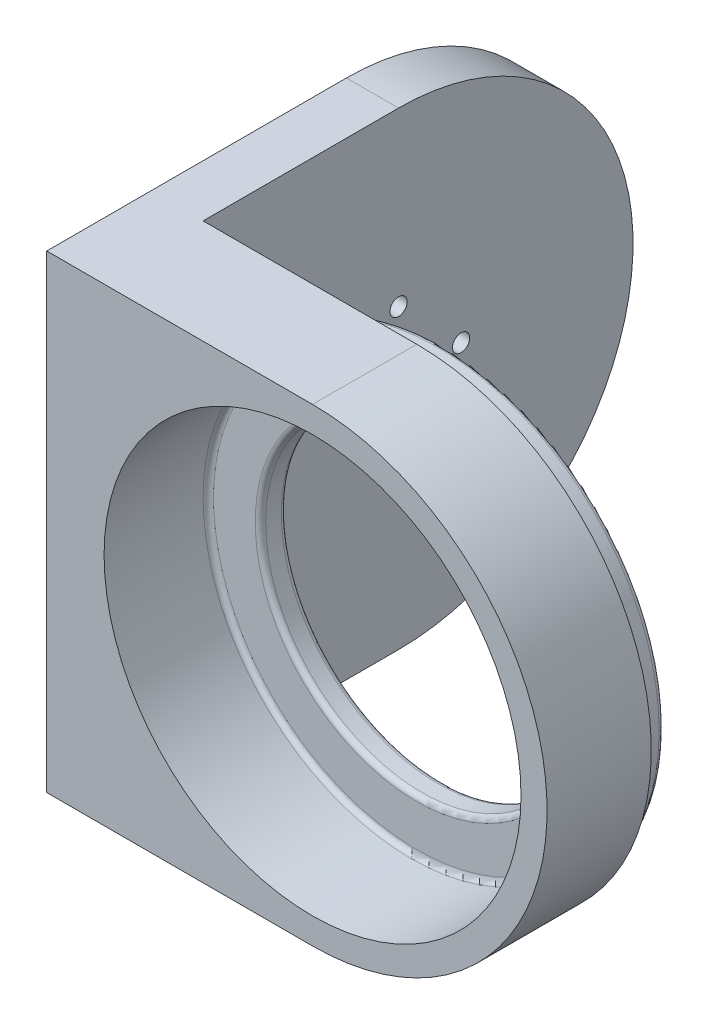
ISO-10303-21;
HEADER;
FILE_DESCRIPTION(('STEP AP214'),'2;1');
FILE_NAME('part.step','',(''),(''),'','','');
FILE_SCHEMA(('AUTOMOTIVE_DESIGN { 1 0 10303 214 1 1 1 1 }'));
ENDSEC;
DATA;
#1=APPLICATION_CONTEXT('core data for automotive mechanical design processes');
#2=APPLICATION_PROTOCOL_DEFINITION('international standard','automotive_design',2000,#1);
#3=PRODUCT_CONTEXT('',#1,'mechanical');
#4=PRODUCT('Part','Part','',(#3));
#5=PRODUCT_RELATED_PRODUCT_CATEGORY('part','',(#4));
#6=PRODUCT_DEFINITION_FORMATION('','',#4);
#7=PRODUCT_DEFINITION_CONTEXT('part definition',#1,'design');
#8=PRODUCT_DEFINITION('design','',#6,#7);
#9=PRODUCT_DEFINITION_SHAPE('','',#8);
#10=(LENGTH_UNIT() NAMED_UNIT(*) SI_UNIT(.MILLI.,.METRE.));
#11=(NAMED_UNIT(*) PLANE_ANGLE_UNIT() SI_UNIT($,.RADIAN.));
#12=(NAMED_UNIT(*) SI_UNIT($,.STERADIAN.) SOLID_ANGLE_UNIT());
#13=UNCERTAINTY_MEASURE_WITH_UNIT(LENGTH_MEASURE(1.E-05),#10,'distance_accuracy_value','');
#14=(GEOMETRIC_REPRESENTATION_CONTEXT(3) GLOBAL_UNCERTAINTY_ASSIGNED_CONTEXT((#13)) GLOBAL_UNIT_ASSIGNED_CONTEXT((#10,
#11,#12)) REPRESENTATION_CONTEXT('',''));
#15=CARTESIAN_POINT('',(0.,0.,0.));
#16=DIRECTION('',(0.,0.,1.));
#17=DIRECTION('',(1.,0.,0.));
#18=AXIS2_PLACEMENT_3D('',#15,#16,#17);
#19=CARTESIAN_POINT('',(0.,0.,15.));
#20=DIRECTION('',(0.,0.,1.));
#21=DIRECTION('',(1.,0.,0.));
#22=AXIS2_PLACEMENT_3D('',#19,#20,#21);
#23=CYLINDRICAL_SURFACE('',#22,42.5);
#24=CARTESIAN_POINT('',(0.,0.,19.));
#25=DIRECTION('',(0.,0.,-1.));
#26=DIRECTION('',(-1.,0.,0.));
#27=AXIS2_PLACEMENT_3D('',#24,#25,#26);
#28=CIRCLE('',#27,42.5);
#29=CARTESIAN_POINT('',(-41.,11.1915146427997,19.));
#30=VERTEX_POINT('',#29);
#31=CARTESIAN_POINT('',(-41.,-11.1915146427997,19.));
#32=VERTEX_POINT('',#31);
#33=EDGE_CURVE('E266',#30,#32,#28,.T.);
#34=ORIENTED_EDGE('',*,*,#33,.T.);
#35=DIRECTION('',(0.,0.,1.));
#36=VECTOR('',#35,1.);
#37=CARTESIAN_POINT('',(-41.,-11.1915146427997,15.));
#38=LINE('',#37,#36);
#39=CARTESIAN_POINT('',(-41.,-11.1915146427997,16.));
#40=VERTEX_POINT('',#39);
#41=EDGE_CURVE('E60',#32,#40,#38,.F.);
#42=ORIENTED_EDGE('',*,*,#41,.T.);
#43=CARTESIAN_POINT('',(0.,0.,16.));
#44=DIRECTION('',(0.,0.,1.));
#45=DIRECTION('',(1.,0.,0.));
#46=AXIS2_PLACEMENT_3D('',#43,#44,#45);
#47=CIRCLE('',#46,42.5);
#48=CARTESIAN_POINT('',(-41.,11.1915146427997,16.));
#49=VERTEX_POINT('',#48);
#50=EDGE_CURVE('E264',#40,#49,#47,.T.);
#51=ORIENTED_EDGE('',*,*,#50,.T.);
#52=DIRECTION('',(0.,0.,1.));
#53=VECTOR('',#52,1.);
#54=CARTESIAN_POINT('',(-41.,11.1915146427997,15.));
#55=LINE('',#54,#53);
#56=EDGE_CURVE('E160',#49,#30,#55,.T.);
#57=ORIENTED_EDGE('',*,*,#56,.T.);
#58=EDGE_LOOP('',(#34,#42,#51,#57));
#59=FACE_BOUND('',#58,.T.);
#60=ADVANCED_FACE('F39',(#59),#23,.T.);
#61=CARTESIAN_POINT('',(0.,0.,15.));
#62=DIRECTION('',(0.,0.,1.));
#63=DIRECTION('',(1.,0.,0.));
#64=AXIS2_PLACEMENT_3D('',#61,#62,#63);
#65=PLANE('',#64);
#66=CARTESIAN_POINT('',(0.,0.,15.));
#67=DIRECTION('',(0.,0.,1.));
#68=DIRECTION('',(1.,0.,0.));
#69=AXIS2_PLACEMENT_3D('',#66,#67,#68);
#70=CIRCLE('',#69,31.);
#71=CARTESIAN_POINT('',(31.,0.,15.));
#72=VERTEX_POINT('',#71);
#73=EDGE_CURVE('E261',#72,#72,#70,.T.);
#74=ORIENTED_EDGE('',*,*,#73,.T.);
#75=EDGE_LOOP('',(#74));
#76=FACE_BOUND('',#75,.T.);
#77=DIRECTION('',(0.,-1.,0.));
#78=VECTOR('',#77,1.);
#79=CARTESIAN_POINT('',(-41.,0.,15.));
#80=LINE('',#79,#78);
#81=CARTESIAN_POINT('',(-41.,6.42261628933261,15.));
#82=VERTEX_POINT('',#81);
#83=CARTESIAN_POINT('',(-41.,-6.42261628933263,15.));
#84=VERTEX_POINT('',#83);
#85=EDGE_CURVE('E155',#82,#84,#80,.T.);
#86=ORIENTED_EDGE('',*,*,#85,.F.);
#87=CARTESIAN_POINT('',(0.,0.,15.));
#88=DIRECTION('',(0.,0.,1.));
#89=DIRECTION('',(1.,0.,0.));
#90=AXIS2_PLACEMENT_3D('',#87,#88,#89);
#91=CIRCLE('',#90,41.5);
#92=EDGE_CURVE('E258',#82,#84,#91,.F.);
#93=ORIENTED_EDGE('',*,*,#92,.T.);
#94=EDGE_LOOP('',(#86,#93));
#95=FACE_BOUND('',#94,.T.);
#96=ADVANCED_FACE('F190',(#76,#95),#65,.F.);
#97=CARTESIAN_POINT('',(0.,0.,16.));
#98=DIRECTION('',(0.,0.,1.));
#99=DIRECTION('',(1.,0.,0.));
#100=AXIS2_PLACEMENT_3D('',#97,#98,#99);
#101=TOROIDAL_SURFACE('',#100,41.5,1.);
#102=ORIENTED_EDGE('',*,*,#92,.F.);
#103=CARTESIAN_POINT('',(-41.,0.,15.1339745962156));
#104=CARTESIAN_POINT('',(-41.,0.16654925954188,15.1339759944302));
#105=CARTESIAN_POINT('',(-41.,0.333098186055232,15.1333866185253));
#106=CARTESIAN_POINT('',(-41.,0.666214097558139,15.1310613578074));
#107=CARTESIAN_POINT('',(-41.,0.832781081304264,15.129325293903));
#108=CARTESIAN_POINT('',(-41.,1.16616873406545,15.1247856559886));
#109=CARTESIAN_POINT('',(-41.,1.33298937924066,15.1219803658554));
#110=CARTESIAN_POINT('',(-41.,1.66654317779587,15.1154426836272));
#111=CARTESIAN_POINT('',(-41.,1.83327633881012,15.1117106757406));
#112=CARTESIAN_POINT('',(-41.,2.33417011704879,15.0993658194511));
#113=CARTESIAN_POINT('',(-41.,2.66830206988371,15.089615407363));
#114=CARTESIAN_POINT('',(-41.,3.33652923321748,15.0689362654192));
#115=CARTESIAN_POINT('',(-41.,3.67062444332336,15.0580075239952));
#116=CARTESIAN_POINT('',(-41.,4.33996879827621,15.0371760440893));
#117=CARTESIAN_POINT('',(-41.,4.675218065342,15.027276859354));
#118=CARTESIAN_POINT('',(-41.,5.3457053195771,15.0111084654765));
#119=CARTESIAN_POINT('',(-41.,5.68094327707137,15.0048381145433));
#120=CARTESIAN_POINT('',(-41.,6.35144343052128,14.9988806619948));
#121=CARTESIAN_POINT('',(-41.,6.68670560873505,14.9991922655483));
#122=CARTESIAN_POINT('',(-41.,7.18969200102459,15.0074746540093));
#123=CARTESIAN_POINT('',(-41.,7.35747779178201,15.0115430929769));
#124=CARTESIAN_POINT('',(-41.,7.69293113471216,15.0229323615611));
#125=CARTESIAN_POINT('',(-41.,7.86059869470406,15.0302529508853));
#126=CARTESIAN_POINT('',(-41.,8.19447134938655,15.0488624751499));
#127=CARTESIAN_POINT('',(-41.,8.36067805035496,15.0601215062284));
#128=CARTESIAN_POINT('',(-41.,8.69273428796093,15.0876619001442));
#129=CARTESIAN_POINT('',(-41.,8.85858369932516,15.1039448033291));
#130=CARTESIAN_POINT('',(-41.,9.18918926649076,15.1429561228353));
#131=CARTESIAN_POINT('',(-41.,9.35394703167194,15.1656701548952));
#132=CARTESIAN_POINT('',(-41.,9.59994275508619,15.2063617442809));
#133=CARTESIAN_POINT('',(-41.,9.68172965653085,15.2210242698815));
#134=CARTESIAN_POINT('',(-41.,9.84477554461047,15.2530198764621));
#135=CARTESIAN_POINT('',(-41.,9.92603461859115,15.2703525032174));
#136=CARTESIAN_POINT('',(-41.,10.0482150011826,15.2990343442899));
#137=CARTESIAN_POINT('',(-41.,10.0894236147881,15.3091628593734));
#138=CARTESIAN_POINT('',(-41.,10.1715925660758,15.3304029576426));
#139=CARTESIAN_POINT('',(-41.,10.2125528723192,15.3415146626449));
#140=CARTESIAN_POINT('',(-41.,10.3352017696839,15.3765934605147));
#141=CARTESIAN_POINT('',(-41.,10.4164161625184,15.4022490986213));
#142=CARTESIAN_POINT('',(-41.,10.5759350774047,15.4593907983805));
#143=CARTESIAN_POINT('',(-41.,10.654260934456,15.4908141908282));
#144=CARTESIAN_POINT('',(-41.,10.7684273124471,15.5446456538991));
#145=CARTESIAN_POINT('',(-41.,10.8058561267912,15.5636600245523));
#146=CARTESIAN_POINT('',(-41.,10.87907402303,15.6045896023595));
#147=CARTESIAN_POINT('',(-41.,10.9148650928253,15.6265011600168));
#148=CARTESIAN_POINT('',(-41.,10.9843711679713,15.674534555652));
#149=CARTESIAN_POINT('',(-41.,11.0180449045295,15.7007169314957));
#150=CARTESIAN_POINT('',(-41.,11.0803198784303,15.7584375675631));
#151=CARTESIAN_POINT('',(-41.,11.1089670574338,15.7899215358693));
#152=CARTESIAN_POINT('',(-41.,11.142206123792,15.8389072785835));
#153=CARTESIAN_POINT('',(-41.,11.1509560383008,15.8535518574141));
#154=CARTESIAN_POINT('',(-41.,11.166287957566,15.8839622628997));
#155=CARTESIAN_POINT('',(-41.,11.1728698680017,15.8997281383012));
#156=CARTESIAN_POINT('',(-41.,11.1833261275299,15.9323481227474));
#157=CARTESIAN_POINT('',(-41.,11.1871703958418,15.9492121645072));
#158=CARTESIAN_POINT('',(-41.,11.1915408589256,15.9833595985642));
#159=CARTESIAN_POINT('',(-41.,11.1920713165518,16.0006424233835));
#160=CARTESIAN_POINT('',(-41.,11.1898777990685,16.0331332698421));
#161=CARTESIAN_POINT('',(-41.,11.1874949920205,16.0483659308271));
#162=CARTESIAN_POINT('',(-41.,11.180295603012,16.0782438085733));
#163=CARTESIAN_POINT('',(-41.,11.1754767199281,16.0928884557509));
#164=CARTESIAN_POINT('',(-41.,11.1614140246486,16.1272018995007));
#165=CARTESIAN_POINT('',(-41.,11.1511651151961,16.1464547588343));
#166=CARTESIAN_POINT('',(-41.,11.1278032545629,16.18312756366));
#167=CARTESIAN_POINT('',(-41.,11.1146830032116,16.2005426664));
#168=CARTESIAN_POINT('',(-41.,11.0752643426766,16.2468788437573));
#169=CARTESIAN_POINT('',(-41.,11.0467896471521,16.2739234981883));
#170=CARTESIAN_POINT('',(-41.,10.9864700731128,16.3238865388086));
#171=CARTESIAN_POINT('',(-41.,10.9546151541657,16.3467920530386));
#172=CARTESIAN_POINT('',(-41.,10.8714923195934,16.4008449825592));
#173=CARTESIAN_POINT('',(-41.,10.8188909077901,16.4299182422838));
#174=CARTESIAN_POINT('',(-41.,10.7112321130776,16.4831783551134));
#175=CARTESIAN_POINT('',(-41.,10.6561692872689,16.5073536513009));
#176=CARTESIAN_POINT('',(-41.,10.5443079870043,16.5521869791427));
#177=CARTESIAN_POINT('',(-41.,10.4875019118678,16.5728258586398));
#178=CARTESIAN_POINT('',(-41.,10.3730207727194,16.6112396357736));
#179=CARTESIAN_POINT('',(-41.,10.3153467971812,16.6290178391343));
#180=CARTESIAN_POINT('',(-41.,10.1421323054648,16.6787538727931));
#181=CARTESIAN_POINT('',(-41.,10.0256424462261,16.7073952186103));
#182=CARTESIAN_POINT('',(-41.,9.79128973266856,16.7584724852802));
#183=CARTESIAN_POINT('',(-41.,9.67342601655404,16.7809042654825));
#184=CARTESIAN_POINT('',(-41.,9.43663841734632,16.8210761910702));
#185=CARTESIAN_POINT('',(-41.,9.31771274538484,16.8388056651092));
#186=CARTESIAN_POINT('',(-41.,9.07935882723929,16.8705014409789));
#187=CARTESIAN_POINT('',(-41.,8.9599305287597,16.8844673408815));
#188=CARTESIAN_POINT('',(-41.,8.72064199550034,16.9093359781969));
#189=CARTESIAN_POINT('',(-41.,8.60078145284299,16.920235711536));
#190=CARTESIAN_POINT('',(-41.,8.36085059828731,16.9394648634152));
#191=CARTESIAN_POINT('',(-41.,8.24078027350425,16.9477941180661));
#192=CARTESIAN_POINT('',(-41.,7.88073727510217,16.9695166978232));
#193=CARTESIAN_POINT('',(-41.,7.64057007398002,16.9796798242291));
#194=CARTESIAN_POINT('',(-41.,7.0939308665163,16.9956684851266));
#195=CARTESIAN_POINT('',(-41.,6.7874084389766,16.99952946596));
#196=CARTESIAN_POINT('',(-41.,6.17433866169714,17.0003885224842));
#197=CARTESIAN_POINT('',(-41.,5.86779131359375,16.9973857452877));
#198=CARTESIAN_POINT('',(-41.,5.25449900250148,16.9870362856839));
#199=CARTESIAN_POINT('',(-41.,4.94775411600042,16.9796856232929));
#200=CARTESIAN_POINT('',(-41.,4.33432424487866,16.9627650824445));
#201=CARTESIAN_POINT('',(-41.,4.02763926159554,16.9531951590883));
#202=CARTESIAN_POINT('',(-41.,3.41508805409059,16.9337422061518));
#203=CARTESIAN_POINT('',(-41.,3.10922180005842,16.9238600672482));
#204=CARTESIAN_POINT('',(-41.,2.49744523013731,16.9054156026152));
#205=CARTESIAN_POINT('',(-41.,2.19153491397005,16.8968532856244));
#206=CARTESIAN_POINT('',(-41.,1.57982298562344,16.8824296501828));
#207=CARTESIAN_POINT('',(-41.,1.27402141201625,16.8765667822047));
#208=CARTESIAN_POINT('',(-41.,0.66237087902789,16.8684828024491));
#209=CARTESIAN_POINT('',(-41.,0.356521920222649,16.8662616494249));
#210=CARTESIAN_POINT('',(-41.,-0.255220040270112,16.8658252835105));
#211=CARTESIAN_POINT('',(-41.,-0.561113042362815,16.8676106079563));
#212=CARTESIAN_POINT('',(-41.,-1.17285556768692,16.8748951471053));
#213=CARTESIAN_POINT('',(-41.,-1.47870509042251,16.8803944012179));
#214=CARTESIAN_POINT('',(-41.,-2.09048440647676,16.8942192020807));
#215=CARTESIAN_POINT('',(-41.,-2.39641416727031,16.9025461119192));
#216=CARTESIAN_POINT('',(-41.,-3.00822554152113,16.9206873951668));
#217=CARTESIAN_POINT('',(-41.,-3.3141071552214,16.9305017608108));
#218=CARTESIAN_POINT('',(-41.,-3.92602831047681,16.9499912317255));
#219=CARTESIAN_POINT('',(-41.,-4.23206785437363,16.9596662647599));
#220=CARTESIAN_POINT('',(-41.,-4.84420233981981,16.9770266048787));
#221=CARTESIAN_POINT('',(-41.,-5.15029728021104,16.984711949619));
#222=CARTESIAN_POINT('',(-41.,-5.76241321298978,16.9960065954786));
#223=CARTESIAN_POINT('',(-41.,-6.06843416296469,16.9996179820786));
#224=CARTESIAN_POINT('',(-41.,-6.68047543659044,17.0003268669272));
#225=CARTESIAN_POINT('',(-41.,-6.98649575627693,16.9974251132222));
#226=CARTESIAN_POINT('',(-41.,-7.47780871530593,16.9849435855977));
#227=CARTESIAN_POINT('',(-41.,-7.66317605954306,16.9784444127436));
#228=CARTESIAN_POINT('',(-41.,-8.03375037238825,16.9608837997502));
#229=CARTESIAN_POINT('',(-41.,-8.21895728597525,16.9498211598203));
#230=CARTESIAN_POINT('',(-41.,-8.58904285537393,16.9218433176448));
#231=CARTESIAN_POINT('',(-41.,-8.77392131339548,16.904925336997));
#232=CARTESIAN_POINT('',(-41.,-9.05054495575583,16.8737088451195));
#233=CARTESIAN_POINT('',(-41.,-9.1426205184376,16.8623326879222));
#234=CARTESIAN_POINT('',(-41.,-9.32645584312157,16.8372803220513));
#235=CARTESIAN_POINT('',(-41.,-9.4182156263981,16.8236042715467));
#236=CARTESIAN_POINT('',(-41.,-9.60161975815268,16.7934471960293));
#237=CARTESIAN_POINT('',(-41.,-9.69326248579333,16.7769561944676));
#238=CARTESIAN_POINT('',(-41.,-9.87592377130893,16.7405588211516));
#239=CARTESIAN_POINT('',(-41.,-9.96694200163463,16.7206507812411));
#240=CARTESIAN_POINT('',(-41.,-10.1478315899765,16.676511871033));
#241=CARTESIAN_POINT('',(-41.,-10.2377041717203,16.6522861160477));
#242=CARTESIAN_POINT('',(-41.,-10.415618360523,16.5980475055977));
#243=CARTESIAN_POINT('',(-41.,-10.5036619250453,16.5680412320484));
#244=CARTESIAN_POINT('',(-41.,-10.6605592271077,16.5059066505974));
#245=CARTESIAN_POINT('',(-41.,-10.7299496733288,16.4751980006422));
#246=CARTESIAN_POINT('',(-41.,-10.8308229199657,16.4227878557531));
#247=CARTESIAN_POINT('',(-41.,-10.8639327825479,16.4042455655298));
#248=CARTESIAN_POINT('',(-41.,-10.9284562305603,16.3644419264858));
#249=CARTESIAN_POINT('',(-41.,-10.9598720460066,16.3431842828504));
#250=CARTESIAN_POINT('',(-41.,-11.0204337185424,16.2968016622899));
#251=CARTESIAN_POINT('',(-41.,-11.0495430795308,16.2716282174425));
#252=CARTESIAN_POINT('',(-41.,-11.1027126461873,16.2164841843199));
#253=CARTESIAN_POINT('',(-41.,-11.1268163409343,16.1865592792156));
#254=CARTESIAN_POINT('',(-41.,-11.1546575206475,16.1396190373706));
#255=CARTESIAN_POINT('',(-41.,-11.1621997340148,16.1248858801156));
#256=CARTESIAN_POINT('',(-41.,-11.1749801383624,16.0944370059805));
#257=CARTESIAN_POINT('',(-41.,-11.1802197157051,16.0787218868447));
#258=CARTESIAN_POINT('',(-41.,-11.1879148794643,16.04645252655));
#259=CARTESIAN_POINT('',(-41.,-11.1903446346938,16.0298919386596));
#260=CARTESIAN_POINT('',(-41.,-11.1920177410379,15.996611448371));
#261=CARTESIAN_POINT('',(-41.,-11.1912625685886,15.9798916233762));
#262=CARTESIAN_POINT('',(-41.,-11.186896802533,15.9484861818449));
#263=CARTESIAN_POINT('',(-41.,-11.1835678954427,15.933759609556));
#264=CARTESIAN_POINT('',(-41.,-11.1747213694846,15.9049849028601));
#265=CARTESIAN_POINT('',(-41.,-11.1692022044549,15.8909372555999));
#266=CARTESIAN_POINT('',(-41.,-11.1528394556771,15.8561617863947));
#267=CARTESIAN_POINT('',(-41.,-11.1407387431922,15.8360296192935));
#268=CARTESIAN_POINT('',(-41.,-11.1136053040245,15.7978533497554));
#269=CARTESIAN_POINT('',(-41.,-11.0985638085116,15.7798157558336));
#270=CARTESIAN_POINT('',(-41.,-11.0524840779583,15.7305656265178));
#271=CARTESIAN_POINT('',(-41.,-11.0189910276118,15.7016816341249));
#272=CARTESIAN_POINT('',(-41.,-10.9485258613626,15.6486140357035));
#273=CARTESIAN_POINT('',(-41.,-10.9115434672225,15.6244450027667));
#274=CARTESIAN_POINT('',(-41.,-10.8123984589706,15.5658389826128));
#275=CARTESIAN_POINT('',(-41.,-10.748638595926,15.5341333212786));
#276=CARTESIAN_POINT('',(-41.,-10.618509442546,15.4765158740689));
#277=CARTESIAN_POINT('',(-41.,-10.5521341993448,15.4506183246675));
#278=CARTESIAN_POINT('',(-41.,-10.4175481463677,15.4029467500065));
#279=CARTESIAN_POINT('',(-41.,-10.349329647229,15.3811946349311));
#280=CARTESIAN_POINT('',(-41.,-10.2120366981671,15.3409935876336));
#281=CARTESIAN_POINT('',(-41.,-10.1429634066843,15.3225406177469));
#282=CARTESIAN_POINT('',(-41.,-10.0006602104494,15.2873757249553));
#283=CARTESIAN_POINT('',(-41.,-9.92739707089823,15.2707994470311));
#284=CARTESIAN_POINT('',(-41.,-9.78037398204468,15.2400022968332));
#285=CARTESIAN_POINT('',(-41.,-9.7066139683919,15.225781735999));
#286=CARTESIAN_POINT('',(-41.,-9.48473341028359,15.1860496716291));
#287=CARTESIAN_POINT('',(-41.,-9.33608494783494,15.1634848020314));
#288=CARTESIAN_POINT('',(-41.,-9.03768146924527,15.1241210458189));
#289=CARTESIAN_POINT('',(-41.,-8.88792461405847,15.1073367429877));
#290=CARTESIAN_POINT('',(-41.,-8.58801903324945,15.0783417632432));
#291=CARTESIAN_POINT('',(-41.,-8.43787043098691,15.0661297888725));
#292=CARTESIAN_POINT('',(-41.,-8.13717465108749,15.0453585864734));
#293=CARTESIAN_POINT('',(-41.,-7.98662722353318,15.0368030805368));
#294=CARTESIAN_POINT('',(-41.,-7.68538568650256,15.0226948211203));
#295=CARTESIAN_POINT('',(-41.,-7.53469156775748,15.0171422716417));
#296=CARTESIAN_POINT('',(-41.,-7.08294493509953,15.0041864603472));
#297=CARTESIAN_POINT('',(-41.,-6.78178831624553,15.0004580536808));
#298=CARTESIAN_POINT('',(-41.,-6.21030759963583,14.9996660078056));
#299=CARTESIAN_POINT('',(-41.,-5.93998140621382,15.0019595089197));
#300=CARTESIAN_POINT('',(-41.,-5.39937589015193,15.0101421650483));
#301=CARTESIAN_POINT('',(-41.,-5.12909656994466,15.0160314704139));
#302=CARTESIAN_POINT('',(-41.,-4.58844163171038,15.0299102491046));
#303=CARTESIAN_POINT('',(-41.,-4.31806604705196,15.0379009219944));
#304=CARTESIAN_POINT('',(-41.,-3.77733828036435,15.0546494870526));
#305=CARTESIAN_POINT('',(-41.,-3.50698609845371,15.0634073829031));
#306=CARTESIAN_POINT('',(-41.,-2.96694276642896,15.0804630232155));
#307=CARTESIAN_POINT('',(-41.,-2.69725165229194,15.0887618626286));
#308=CARTESIAN_POINT('',(-41.,-2.15782897778616,15.1038678804461));
#309=CARTESIAN_POINT('',(-41.,-1.88809741793082,15.1106750764064));
#310=CARTESIAN_POINT('',(-41.,-1.34865390058677,15.1219439450766));
#311=CARTESIAN_POINT('',(-41.,-1.07894195642788,15.1264062308875));
#312=CARTESIAN_POINT('',(-41.,-0.539486383433882,15.132420409968));
#313=CARTESIAN_POINT('',(-41.,-0.269742754934061,15.1339723316708));
#314=CARTESIAN_POINT('',(-41.,0.,15.1339745962156));
#315=B_SPLINE_CURVE_WITH_KNOTS('',3,(#103,#104,#105,#106,#107,#108,#109,#110,#111,#112,#113,
#114,#115,#116,#117,#118,#119,#120,#121,#122,#123,#124,#125,#126,#127,#128,#129,#130,#131,#132,
#133,#134,#135,#136,#137,#138,#139,#140,#141,#142,#143,#144,#145,#146,#147,#148,#149,#150,#151,
#152,#153,#154,#155,#156,#157,#158,#159,#160,#161,#162,#163,#164,#165,#166,#167,#168,#169,#170,
#171,#172,#173,#174,#175,#176,#177,#178,#179,#180,#181,#182,#183,#184,#185,#186,#187,#188,#189,
#190,#191,#192,#193,#194,#195,#196,#197,#198,#199,#200,#201,#202,#203,#204,#205,#206,#207,#208,
#209,#210,#211,#212,#213,#214,#215,#216,#217,#218,#219,#220,#221,#222,#223,#224,#225,#226,#227,
#228,#229,#230,#231,#232,#233,#234,#235,#236,#237,#238,#239,#240,#241,#242,#243,#244,#245,#246,
#247,#248,#249,#250,#251,#252,#253,#254,#255,#256,#257,#258,#259,#260,#261,#262,#263,#264,#265,
#266,#267,#268,#269,#270,#271,#272,#273,#274,#275,#276,#277,#278,#279,#280,#281,#282,#283,#284,
#285,#286,#287,#288,#289,#290,#291,#292,#293,#294,#295,#296,#297,#298,#299,#300,#301,#302,#303,
#304,#305,#306,#307,#308,#309,#310,#311,#312,#313,#314),.UNSPECIFIED.,.T.,.F.,(4,2,2,2,2,2,2,2,
2,2,2,2,2,2,2,2,2,2,2,2,2,2,2,2,2,2,2,2,2,2,2,2,2,2,2,2,2,2,2,2,2,2,2,2,2,2,2,2,2,2,2,2,2,2,2,2,
2,2,2,2,2,2,2,2,2,2,2,2,2,2,2,2,2,2,2,2,2,2,2,2,2,2,2,2,2,2,2,2,2,2,2,2,2,2,2,2,2,2,2,2,2,2,2,2,
2,4),(0.,0.499646199589656,0.99937045319515,1.49990017209443,2.00022272159645,3.0030368616892,
4.00586084791168,5.01203881024087,6.01790001227588,7.02356333868823,7.52704423499714,
8.03048793668775,8.53018920916069,9.03004384537192,9.52878918976803,9.77802982116346,
10.0272280996675,10.1545231534939,10.2818340012353,10.5371998542774,10.7899396947011,
10.9157977318172,11.041498713565,11.1691674011683,11.2956003951254,11.346641893681,
11.3976856125435,11.4492818824676,11.5008117657527,11.546844078307,11.5929199545741,
11.6579793914766,11.7232061995216,11.8403563057588,11.9578646823109,12.1377125657768,
12.3179799873781,12.4991947778853,12.6801986335612,13.0397909790518,13.3996225327602,
13.760263828139,14.120943622694,14.4819755718739,14.8430305350849,15.5640486288179,
16.483573915994,17.4032134691526,18.3236961510768,19.2441974572839,20.1622752793296,
21.0803591796941,21.9979154260384,22.9154612798623,23.8331301993644,24.7508088566311,
25.668930515811,26.5870473821492,27.5056242471382,28.4241837263174,29.3422727763827,
30.2602563876176,30.8166564036452,31.3732027972949,31.9300136391807,32.2083180829408,
32.486603394884,32.7658962804142,33.0453259031368,33.3244266524283,33.6032114656762,
33.8304186245739,33.9441729018957,34.0577735837097,34.1729124680138,34.2870048033328,
34.3365079691684,34.3859812893542,34.4359058988411,34.4858073673325,34.5309082097453,
34.576040946853,34.6461009398457,34.7163731146874,34.8483110016216,34.9806504392585,
35.1937271301081,35.4073205275288,35.6220133065998,35.8364415075896,36.0617376993169,
36.2870636527954,36.7379389366378,37.18994354045,37.6418197847123,38.0941549258086,
38.5465207917585,39.4499312952018,40.2609117569849,41.0719261305534,41.8834044800478,
42.694886724083,43.5043416080316,44.313786964611,45.1230205779295,45.932246285329),.UNSPECIFIED.);
#316=EDGE_CURVE('E67',#82,#49,#315,.T.);
#317=ORIENTED_EDGE('',*,*,#316,.T.);
#318=ORIENTED_EDGE('',*,*,#50,.F.);
#319=EDGE_CURVE('E152',#40,#84,#315,.T.);
#320=ORIENTED_EDGE('',*,*,#319,.T.);
#321=EDGE_LOOP('',(#102,#317,#318,#320));
#322=FACE_BOUND('',#321,.T.);
#323=ADVANCED_FACE('F171',(#322),#101,.T.);
#324=CARTESIAN_POINT('',(0.,0.,40.));
#325=DIRECTION('',(0.,0.,-1.));
#326=DIRECTION('',(-1.,0.,0.));
#327=AXIS2_PLACEMENT_3D('',#324,#325,#326);
#328=CYLINDRICAL_SURFACE('',#327,45.);
#329=CARTESIAN_POINT('',(0.,0.,20.));
#330=DIRECTION('',(0.,0.,-1.));
#331=DIRECTION('',(-1.,0.,0.));
#332=AXIS2_PLACEMENT_3D('',#329,#330,#331);
#333=CIRCLE('',#332,45.);
#334=CARTESIAN_POINT('',(-1.57116660247941E-13,45.,20.));
#335=VERTEX_POINT('',#334);
#336=CARTESIAN_POINT('',(-1.57116660247941E-13,-45.,20.));
#337=VERTEX_POINT('',#336);
#338=EDGE_CURVE('E283',#335,#337,#333,.T.);
#339=ORIENTED_EDGE('',*,*,#338,.F.);
#340=DIRECTION('',(0.,0.,-1.));
#341=VECTOR('',#340,1.);
#342=CARTESIAN_POINT('',(-1.57116660247941E-13,45.,40.));
#343=LINE('',#342,#341);
#344=CARTESIAN_POINT('',(-1.57116660247941E-13,45.,40.));
#345=VERTEX_POINT('',#344);
#346=EDGE_CURVE('E268',#345,#335,#343,.T.);
#347=ORIENTED_EDGE('',*,*,#346,.F.);
#348=CARTESIAN_POINT('',(0.,0.,40.));
#349=DIRECTION('',(0.,0.,1.));
#350=DIRECTION('',(1.,0.,0.));
#351=AXIS2_PLACEMENT_3D('',#348,#349,#350);
#352=CIRCLE('',#351,45.);
#353=CARTESIAN_POINT('',(-1.57116660247941E-13,-45.,40.));
#354=VERTEX_POINT('',#353);
#355=EDGE_CURVE('E277',#354,#345,#352,.T.);
#356=ORIENTED_EDGE('',*,*,#355,.F.);
#357=DIRECTION('',(0.,0.,-1.));
#358=VECTOR('',#357,1.);
#359=CARTESIAN_POINT('',(-1.57116660247941E-13,-45.,40.));
#360=LINE('',#359,#358);
#361=EDGE_CURVE('E271',#354,#337,#360,.T.);
#362=ORIENTED_EDGE('',*,*,#361,.T.);
#363=EDGE_LOOP('',(#339,#347,#356,#362));
#364=FACE_BOUND('',#363,.T.);
#365=ADVANCED_FACE('F458',(#364),#328,.T.);
#366=CARTESIAN_POINT('',(-1.57116660247941E-13,45.,40.));
#367=DIRECTION('',(0.,-1.,0.));
#368=DIRECTION('',(1.,0.,0.));
#369=AXIS2_PLACEMENT_3D('',#366,#367,#368);
#370=PLANE('',#369);
#371=DIRECTION('',(1.,0.,0.));
#372=VECTOR('',#371,1.);
#373=CARTESIAN_POINT('',(-1.57116660247941E-13,45.,20.));
#374=LINE('',#373,#372);
#375=CARTESIAN_POINT('',(-41.,45.,20.));
#376=VERTEX_POINT('',#375);
#377=EDGE_CURVE('E285',#376,#335,#374,.T.);
#378=ORIENTED_EDGE('',*,*,#377,.F.);
#379=DIRECTION('',(0.,0.,-1.));
#380=VECTOR('',#379,1.);
#381=CARTESIAN_POINT('',(-41.,45.,40.));
#382=LINE('',#381,#380);
#383=CARTESIAN_POINT('',(-41.,45.,-17.5));
#384=VERTEX_POINT('',#383);
#385=EDGE_CURVE('E147',#376,#384,#382,.T.);
#386=ORIENTED_EDGE('',*,*,#385,.T.);
#387=DIRECTION('',(1.,0.,0.));
#388=VECTOR('',#387,1.);
#389=CARTESIAN_POINT('',(-51.,45.,-17.5));
#390=LINE('',#389,#388);
#391=CARTESIAN_POINT('',(-51.,45.,-17.5));
#392=VERTEX_POINT('',#391);
#393=EDGE_CURVE('E153',#392,#384,#390,.T.);
#394=ORIENTED_EDGE('',*,*,#393,.F.);
#395=DIRECTION('',(0.,0.,-1.));
#396=VECTOR('',#395,1.);
#397=CARTESIAN_POINT('',(-51.,45.,40.));
#398=LINE('',#397,#396);
#399=CARTESIAN_POINT('',(-51.,45.,40.));
#400=VERTEX_POINT('',#399);
#401=EDGE_CURVE('E143',#400,#392,#398,.T.);
#402=ORIENTED_EDGE('',*,*,#401,.F.);
#403=DIRECTION('',(-1.,0.,0.));
#404=VECTOR('',#403,1.);
#405=CARTESIAN_POINT('',(-1.57116660247941E-13,45.,40.));
#406=LINE('',#405,#404);
#407=EDGE_CURVE('E275',#345,#400,#406,.T.);
#408=ORIENTED_EDGE('',*,*,#407,.F.);
#409=ORIENTED_EDGE('',*,*,#346,.T.);
#410=EDGE_LOOP('',(#378,#386,#394,#402,#408,#409));
#411=FACE_BOUND('',#410,.T.);
#412=ADVANCED_FACE('F212',(#411),#370,.F.);
#413=CARTESIAN_POINT('',(-1.57116660247941E-13,-45.,40.));
#414=DIRECTION('',(0.,1.,0.));
#415=DIRECTION('',(-1.,0.,0.));
#416=AXIS2_PLACEMENT_3D('',#413,#414,#415);
#417=PLANE('',#416);
#418=DIRECTION('',(-1.,0.,0.));
#419=VECTOR('',#418,1.);
#420=CARTESIAN_POINT('',(-1.57116660247941E-13,-45.,20.));
#421=LINE('',#420,#419);
#422=CARTESIAN_POINT('',(-41.,-45.,20.));
#423=VERTEX_POINT('',#422);
#424=EDGE_CURVE('E163',#337,#423,#421,.T.);
#425=ORIENTED_EDGE('',*,*,#424,.F.);
#426=ORIENTED_EDGE('',*,*,#361,.F.);
#427=DIRECTION('',(1.,0.,0.));
#428=VECTOR('',#427,1.);
#429=CARTESIAN_POINT('',(-1.57116660247941E-13,-45.,40.));
#430=LINE('',#429,#428);
#431=CARTESIAN_POINT('',(-51.,-45.,40.));
#432=VERTEX_POINT('',#431);
#433=EDGE_CURVE('E132',#432,#354,#430,.T.);
#434=ORIENTED_EDGE('',*,*,#433,.F.);
#435=DIRECTION('',(0.,0.,1.));
#436=VECTOR('',#435,1.);
#437=CARTESIAN_POINT('',(-51.,-45.,40.));
#438=LINE('',#437,#436);
#439=CARTESIAN_POINT('',(-51.,-45.,-17.5));
#440=VERTEX_POINT('',#439);
#441=EDGE_CURVE('E123',#440,#432,#438,.T.);
#442=ORIENTED_EDGE('',*,*,#441,.F.);
#443=DIRECTION('',(1.,0.,0.));
#444=VECTOR('',#443,1.);
#445=CARTESIAN_POINT('',(-51.,-45.,-17.5));
#446=LINE('',#445,#444);
#447=CARTESIAN_POINT('',(-41.,-45.,-17.5));
#448=VERTEX_POINT('',#447);
#449=EDGE_CURVE('E129',#440,#448,#446,.T.);
#450=ORIENTED_EDGE('',*,*,#449,.T.);
#451=DIRECTION('',(0.,0.,1.));
#452=VECTOR('',#451,1.);
#453=CARTESIAN_POINT('',(-41.,-45.,40.));
#454=LINE('',#453,#452);
#455=EDGE_CURVE('E299',#448,#423,#454,.T.);
#456=ORIENTED_EDGE('',*,*,#455,.T.);
#457=EDGE_LOOP('',(#425,#426,#434,#442,#450,#456));
#458=FACE_BOUND('',#457,.T.);
#459=ADVANCED_FACE('F126',(#458),#417,.F.);
#460=CARTESIAN_POINT('',(0.,0.,40.));
#461=DIRECTION('',(0.,0.,-1.));
#462=DIRECTION('',(-1.,0.,0.));
#463=AXIS2_PLACEMENT_3D('',#460,#461,#462);
#464=CYLINDRICAL_SURFACE('',#463,40.);
#465=CARTESIAN_POINT('',(0.,0.,21.));
#466=DIRECTION('',(0.,0.,1.));
#467=DIRECTION('',(1.,0.,0.));
#468=AXIS2_PLACEMENT_3D('',#465,#466,#467);
#469=CIRCLE('',#468,40.);
#470=CARTESIAN_POINT('',(40.,0.,21.));
#471=VERTEX_POINT('',#470);
#472=EDGE_CURVE('E244',#471,#471,#469,.F.);
#473=ORIENTED_EDGE('',*,*,#472,.T.);
#474=EDGE_LOOP('',(#473));
#475=FACE_BOUND('',#474,.T.);
#476=CARTESIAN_POINT('',(0.,0.,40.));
#477=DIRECTION('',(0.,0.,1.));
#478=DIRECTION('',(1.,0.,0.));
#479=AXIS2_PLACEMENT_3D('',#476,#477,#478);
#480=CIRCLE('',#479,40.);
#481=CARTESIAN_POINT('',(40.,0.,40.));
#482=VERTEX_POINT('',#481);
#483=EDGE_CURVE('E280',#482,#482,#480,.T.);
#484=ORIENTED_EDGE('',*,*,#483,.T.);
#485=EDGE_LOOP('',(#484));
#486=FACE_BOUND('',#485,.T.);
#487=ADVANCED_FACE('F204',(#475,#486),#464,.F.);
#488=CARTESIAN_POINT('',(0.,0.,40.));
#489=DIRECTION('',(0.,0.,1.));
#490=DIRECTION('',(1.,0.,0.));
#491=AXIS2_PLACEMENT_3D('',#488,#489,#490);
#492=PLANE('',#491);
#493=ORIENTED_EDGE('',*,*,#355,.T.);
#494=ORIENTED_EDGE('',*,*,#407,.T.);
#495=DIRECTION('',(0.,1.,0.));
#496=VECTOR('',#495,1.);
#497=CARTESIAN_POINT('',(-51.,45.,40.));
#498=LINE('',#497,#496);
#499=EDGE_CURVE('E136',#432,#400,#498,.T.);
#500=ORIENTED_EDGE('',*,*,#499,.F.);
#501=ORIENTED_EDGE('',*,*,#433,.T.);
#502=EDGE_LOOP('',(#493,#494,#500,#501));
#503=FACE_BOUND('',#502,.T.);
#504=ORIENTED_EDGE('',*,*,#483,.F.);
#505=EDGE_LOOP('',(#504));
#506=FACE_BOUND('',#505,.T.);
#507=ADVANCED_FACE('F202',(#503,#506),#492,.T.);
#508=CARTESIAN_POINT('',(0.,0.,20.));
#509=DIRECTION('',(0.,0.,-1.));
#510=DIRECTION('',(-1.,0.,0.));
#511=AXIS2_PLACEMENT_3D('',#508,#509,#510);
#512=PLANE('',#511);
#513=DIRECTION('',(0.,1.,0.));
#514=VECTOR('',#513,1.);
#515=CARTESIAN_POINT('',(-41.,45.,20.));
#516=LINE('',#515,#514);
#517=CARTESIAN_POINT('',(-41.,-14.5344418537487,20.));
#518=VERTEX_POINT('',#517);
#519=EDGE_CURVE('E287',#423,#518,#516,.T.);
#520=ORIENTED_EDGE('',*,*,#519,.T.);
#521=CARTESIAN_POINT('',(0.,0.,20.));
#522=DIRECTION('',(0.,0.,-1.));
#523=DIRECTION('',(-1.,0.,0.));
#524=AXIS2_PLACEMENT_3D('',#521,#522,#523);
#525=CIRCLE('',#524,43.5);
#526=CARTESIAN_POINT('',(-41.,14.5344418537487,20.));
#527=VERTEX_POINT('',#526);
#528=EDGE_CURVE('E255',#518,#527,#525,.F.);
#529=ORIENTED_EDGE('',*,*,#528,.T.);
#530=EDGE_CURVE('E288',#527,#376,#516,.T.);
#531=ORIENTED_EDGE('',*,*,#530,.T.);
#532=ORIENTED_EDGE('',*,*,#377,.T.);
#533=ORIENTED_EDGE('',*,*,#338,.T.);
#534=ORIENTED_EDGE('',*,*,#424,.T.);
#535=EDGE_LOOP('',(#520,#529,#531,#532,#533,#534));
#536=FACE_BOUND('',#535,.T.);
#537=ADVANCED_FACE('F196',(#536),#512,.T.);
#538=CARTESIAN_POINT('',(0.,0.,20.));
#539=DIRECTION('',(0.,0.,1.));
#540=DIRECTION('',(1.,0.,0.));
#541=AXIS2_PLACEMENT_3D('',#538,#539,#540);
#542=PLANE('',#541);
#543=CARTESIAN_POINT('',(0.,0.,20.));
#544=DIRECTION('',(0.,0.,1.));
#545=DIRECTION('',(1.,0.,0.));
#546=AXIS2_PLACEMENT_3D('',#543,#544,#545);
#547=CIRCLE('',#546,39.);
#548=CARTESIAN_POINT('',(39.,0.,20.));
#549=VERTEX_POINT('',#548);
#550=EDGE_CURVE('E222',#549,#549,#547,.T.);
#551=ORIENTED_EDGE('',*,*,#550,.T.);
#552=EDGE_LOOP('',(#551));
#553=FACE_BOUND('',#552,.T.);
#554=CARTESIAN_POINT('',(0.,0.,20.));
#555=DIRECTION('',(0.,0.,1.));
#556=DIRECTION('',(1.,0.,0.));
#557=AXIS2_PLACEMENT_3D('',#554,#555,#556);
#558=CIRCLE('',#557,31.);
#559=CARTESIAN_POINT('',(31.,0.,20.));
#560=VERTEX_POINT('',#559);
#561=EDGE_CURVE('E245',#560,#560,#558,.F.);
#562=ORIENTED_EDGE('',*,*,#561,.T.);
#563=EDGE_LOOP('',(#562));
#564=FACE_BOUND('',#563,.T.);
#565=ADVANCED_FACE('F188',(#553,#564),#542,.T.);
#566=CARTESIAN_POINT('',(0.,0.,15.));
#567=DIRECTION('',(0.,0.,1.));
#568=DIRECTION('',(1.,0.,0.));
#569=AXIS2_PLACEMENT_3D('',#566,#567,#568);
#570=CYLINDRICAL_SURFACE('',#569,30.);
#571=CARTESIAN_POINT('',(0.,0.,16.));
#572=DIRECTION('',(0.,0.,1.));
#573=DIRECTION('',(1.,0.,0.));
#574=AXIS2_PLACEMENT_3D('',#571,#572,#573);
#575=CIRCLE('',#574,30.);
#576=CARTESIAN_POINT('',(30.,0.,16.));
#577=VERTEX_POINT('',#576);
#578=EDGE_CURVE('E246',#577,#577,#575,.F.);
#579=ORIENTED_EDGE('',*,*,#578,.T.);
#580=EDGE_LOOP('',(#579));
#581=FACE_BOUND('',#580,.T.);
#582=CARTESIAN_POINT('',(0.,0.,19.));
#583=DIRECTION('',(0.,0.,1.));
#584=DIRECTION('',(1.,0.,0.));
#585=AXIS2_PLACEMENT_3D('',#582,#583,#584);
#586=CIRCLE('',#585,30.);
#587=CARTESIAN_POINT('',(30.,0.,19.));
#588=VERTEX_POINT('',#587);
#589=EDGE_CURVE('E250',#588,#588,#586,.T.);
#590=ORIENTED_EDGE('',*,*,#589,.T.);
#591=EDGE_LOOP('',(#590));
#592=FACE_BOUND('',#591,.T.);
#593=ADVANCED_FACE('F184',(#581,#592),#570,.F.);
#594=CARTESIAN_POINT('',(0.,0.,19.));
#595=DIRECTION('',(0.,0.,-1.));
#596=DIRECTION('',(-1.,0.,0.));
#597=AXIS2_PLACEMENT_3D('',#594,#595,#596);
#598=TOROIDAL_SURFACE('',#597,43.5,1.);
#599=CARTESIAN_POINT('',(-41.,-11.1915146427997,19.));
#600=CARTESIAN_POINT('',(-41.,-11.1914467501853,19.0182282894102));
#601=CARTESIAN_POINT('',(-41.,-11.1934040656737,19.0363507488776));
#602=CARTESIAN_POINT('',(-41.,-11.2006967075203,19.0716140130632));
#603=CARTESIAN_POINT('',(-41.,-11.2059770413921,19.0887659363569));
#604=CARTESIAN_POINT('',(-41.,-11.2209344626389,19.1260590702522));
#605=CARTESIAN_POINT('',(-41.,-11.2313781600989,19.1458836698138));
#606=CARTESIAN_POINT('',(-41.,-11.2552824073391,19.183728212653));
#607=CARTESIAN_POINT('',(-41.,-11.2687626340395,19.2017352231318));
#608=CARTESIAN_POINT('',(-41.,-11.3096168072878,19.2500898112149));
#609=CARTESIAN_POINT('',(-41.,-11.3393158973423,19.278441202579));
#610=CARTESIAN_POINT('',(-41.,-11.4021482212236,19.3309145766964));
#611=CARTESIAN_POINT('',(-41.,-11.4352890521176,19.3550268725612));
#612=CARTESIAN_POINT('',(-41.,-11.5242301057498,19.4138093902983));
#613=CARTESIAN_POINT('',(-41.,-11.581618000423,19.4460511848112));
#614=CARTESIAN_POINT('',(-41.,-11.6990599567411,19.5053332557576));
#615=CARTESIAN_POINT('',(-41.,-11.759120046509,19.5323609526847));
#616=CARTESIAN_POINT('',(-41.,-11.8814236415999,19.5828144719314));
#617=CARTESIAN_POINT('',(-41.,-11.9436829404385,19.606201718442));
#618=CARTESIAN_POINT('',(-41.,-12.0691772313122,19.649894226496));
#619=CARTESIAN_POINT('',(-41.,-12.1324110579417,19.6702028956631));
#620=CARTESIAN_POINT('',(-41.,-12.2937895508654,19.7185736254454));
#621=CARTESIAN_POINT('',(-41.,-12.3924413188841,19.7449405904923));
#622=CARTESIAN_POINT('',(-41.,-12.5908878546755,19.7930145817904));
#623=CARTESIAN_POINT('',(-41.,-12.69068302585,19.8147199064921));
#624=CARTESIAN_POINT('',(-41.,-12.891260878877,19.8541731515167));
#625=CARTESIAN_POINT('',(-41.,-12.9920451703494,19.8719128356305));
#626=CARTESIAN_POINT('',(-41.,-13.194183812956,19.9037810921047));
#627=CARTESIAN_POINT('',(-41.,-13.2955381915875,19.9179094887279));
#628=CARTESIAN_POINT('',(-41.,-13.4916278021707,19.9419144829629));
#629=CARTESIAN_POINT('',(-41.,-13.5863354693798,19.9520177298189));
#630=CARTESIAN_POINT('',(-41.,-13.7760135773918,19.9693669034052));
#631=CARTESIAN_POINT('',(-41.,-13.8709840230766,19.9766127766862));
#632=CARTESIAN_POINT('',(-41.,-14.0606594745379,19.988230912762));
#633=CARTESIAN_POINT('',(-41.,-14.1553636721416,19.9926163309276));
#634=CARTESIAN_POINT('',(-41.,-14.3448582868074,19.9984950278306));
#635=CARTESIAN_POINT('',(-41.,-14.4396487008998,19.9999884026717));
#636=CARTESIAN_POINT('',(-41.,-14.5344418537487,20.));
#637=B_SPLINE_CURVE_WITH_KNOTS('',3,(#599,#600,#601,#602,#603,#604,#605,#606,#607,#608,#609,
#610,#611,#612,#613,#614,#615,#616,#617,#618,#619,#620,#621,#622,#623,#624,#625,#626,#627,#628,
#629,#630,#631,#632,#633,#634,#635,#636),.UNSPECIFIED.,.F.,.F.,(4,2,2,2,2,2,2,2,2,2,2,2,2,2,2,2,
2,2,4),(0.,0.0544110992486418,0.10794461193419,0.174783901213298,0.242069453233889,
0.364558646013793,0.487324203856785,0.684298718427291,0.881742667324794,1.08115410918031,
1.28034318844756,1.5865290465407,1.89282647656523,2.1997542622232,2.50669698114931,
2.79238849416404,3.07808535098758,3.36245883243915,3.64682286387701),.UNSPECIFIED.);
#638=EDGE_CURVE('E11',#32,#518,#637,.T.);
#639=ORIENTED_EDGE('',*,*,#638,.F.);
#640=ORIENTED_EDGE('',*,*,#33,.F.);
#641=CARTESIAN_POINT('',(-41.,14.5344418537487,20.));
#642=CARTESIAN_POINT('',(-41.,14.450820038777,19.9999943399419));
#643=CARTESIAN_POINT('',(-41.,14.3672034758661,19.9988296473963));
#644=CARTESIAN_POINT('',(-41.,14.2000319778398,19.9942422690043));
#645=CARTESIAN_POINT('',(-41.,14.116477042776,19.9908195812694));
#646=CARTESIAN_POINT('',(-41.,13.8657273685264,19.9772408700427));
#647=CARTESIAN_POINT('',(-41.,13.6987026545336,19.9637745713509));
#648=CARTESIAN_POINT('',(-41.,13.3643519262299,19.9278254330916));
#649=CARTESIAN_POINT('',(-41.,13.1970329383822,19.9052761642361));
#650=CARTESIAN_POINT('',(-41.,12.9473569964167,19.8639856473806));
#651=CARTESIAN_POINT('',(-41.,12.8643735752238,19.8489833489218));
#652=CARTESIAN_POINT('',(-41.,12.6989528144854,19.816235860583));
#653=CARTESIAN_POINT('',(-41.,12.6165154180121,19.7984909614912));
#654=CARTESIAN_POINT('',(-41.,12.4523136373729,19.7598744609199));
#655=CARTESIAN_POINT('',(-41.,12.3705497379142,19.7390007852633));
#656=CARTESIAN_POINT('',(-41.,12.2081680368515,19.6935848980521));
#657=CARTESIAN_POINT('',(-41.,12.1275486381306,19.6690484945403));
#658=CARTESIAN_POINT('',(-41.,11.9916033245845,19.6232957336325));
#659=CARTESIAN_POINT('',(-41.,11.9358827519346,19.6032607165702));
#660=CARTESIAN_POINT('',(-41.,11.8254432805946,19.5602907885424));
#661=CARTESIAN_POINT('',(-41.,11.7707264748412,19.5373504666362));
#662=CARTESIAN_POINT('',(-41.,11.659702351444,19.4862629068435));
#663=CARTESIAN_POINT('',(-41.,11.6034968665256,19.4578856997641));
#664=CARTESIAN_POINT('',(-41.,11.5218198810243,19.4109107067993));
#665=CARTESIAN_POINT('',(-41.,11.4950696484866,19.3945444198581));
#666=CARTESIAN_POINT('',(-41.,11.4427916805339,19.359977793455));
#667=CARTESIAN_POINT('',(-41.,11.4172629218101,19.3417790303203));
#668=CARTESIAN_POINT('',(-41.,11.3728357609595,19.3068566817599));
#669=CARTESIAN_POINT('',(-41.,11.3536183966297,19.2905428755141));
#670=CARTESIAN_POINT('',(-41.,11.3168168857805,19.2560291360053));
#671=CARTESIAN_POINT('',(-41.,11.2992376785549,19.2378238277394));
#672=CARTESIAN_POINT('',(-41.,11.2663615531384,19.1988741800488));
#673=CARTESIAN_POINT('',(-41.,11.2511081363584,19.1780921908817));
#674=CARTESIAN_POINT('',(-41.,11.2248449014296,19.13410394933));
#675=CARTESIAN_POINT('',(-41.,11.2137989653558,19.1109206085769));
#676=CARTESIAN_POINT('',(-41.,11.201230584956,19.0728361199294));
#677=CARTESIAN_POINT('',(-41.,11.1976556826517,19.0586163536038));
#678=CARTESIAN_POINT('',(-41.,11.1927668007781,19.0296159915959));
#679=CARTESIAN_POINT('',(-41.,11.1914816976491,19.0148306024724));
#680=CARTESIAN_POINT('',(-41.,11.1915146427997,19.));
#681=B_SPLINE_CURVE_WITH_KNOTS('',3,(#641,#642,#643,#644,#645,#646,#647,#648,#649,#650,#651,
#652,#653,#654,#655,#656,#657,#658,#659,#660,#661,#662,#663,#664,#665,#666,#667,#668,#669,#670,
#671,#672,#673,#674,#675,#676,#677,#678,#679,#680),.UNSPECIFIED.,.F.,.F.,(4,2,2,2,2,2,2,2,2,2,2,
2,2,2,2,2,2,2,2,4),(0.,0.250848011107199,0.501696232025199,1.00415636683076,1.51036002750504,
1.76330950143405,2.0162321744123,2.26932326652096,2.52201720963406,2.69959233341632,
2.87750318159833,3.06609879146973,3.16012433099849,3.25406966815477,3.32960520060922,
3.40536157562681,3.48239586076036,3.55875310686929,3.60256635690063,3.64692832255651),.UNSPECIFIED.);
#682=EDGE_CURVE('E53',#527,#30,#681,.T.);
#683=ORIENTED_EDGE('',*,*,#682,.F.);
#684=ORIENTED_EDGE('',*,*,#528,.F.);
#685=EDGE_LOOP('',(#639,#640,#683,#684));
#686=FACE_BOUND('',#685,.T.);
#687=ADVANCED_FACE('F187',(#686),#598,.F.);
#688=CARTESIAN_POINT('',(0.,0.,16.));
#689=DIRECTION('',(0.,0.,1.));
#690=DIRECTION('',(1.,0.,0.));
#691=AXIS2_PLACEMENT_3D('',#688,#689,#690);
#692=TOROIDAL_SURFACE('',#691,31.,1.);
#693=ORIENTED_EDGE('',*,*,#578,.F.);
#694=EDGE_LOOP('',(#693));
#695=FACE_BOUND('',#694,.T.);
#696=ORIENTED_EDGE('',*,*,#73,.F.);
#697=EDGE_LOOP('',(#696));
#698=FACE_BOUND('',#697,.T.);
#699=ADVANCED_FACE('F227',(#695,#698),#692,.T.);
#700=CARTESIAN_POINT('',(0.,0.,21.));
#701=DIRECTION('',(0.,0.,1.));
#702=DIRECTION('',(1.,0.,0.));
#703=AXIS2_PLACEMENT_3D('',#700,#701,#702);
#704=TOROIDAL_SURFACE('',#703,39.,1.);
#705=ORIENTED_EDGE('',*,*,#550,.F.);
#706=EDGE_LOOP('',(#705));
#707=FACE_BOUND('',#706,.T.);
#708=ORIENTED_EDGE('',*,*,#472,.F.);
#709=EDGE_LOOP('',(#708));
#710=FACE_BOUND('',#709,.T.);
#711=ADVANCED_FACE('F231',(#707,#710),#704,.F.);
#712=CARTESIAN_POINT('',(0.,0.,19.));
#713=DIRECTION('',(0.,0.,1.));
#714=DIRECTION('',(1.,0.,0.));
#715=AXIS2_PLACEMENT_3D('',#712,#713,#714);
#716=TOROIDAL_SURFACE('',#715,31.,1.);
#717=ORIENTED_EDGE('',*,*,#561,.F.);
#718=EDGE_LOOP('',(#717));
#719=FACE_BOUND('',#718,.T.);
#720=ORIENTED_EDGE('',*,*,#589,.F.);
#721=EDGE_LOOP('',(#720));
#722=FACE_BOUND('',#721,.T.);
#723=ADVANCED_FACE('F41',(#719,#722),#716,.T.);
#724=CARTESIAN_POINT('',(-51.,0.,-17.5));
#725=DIRECTION('',(-1.,0.,0.));
#726=DIRECTION('',(0.,-1.,0.));
#727=AXIS2_PLACEMENT_3D('',#724,#725,#726);
#728=PLANE('',#727);
#729=CARTESIAN_POINT('',(-51.,0.,-17.5));
#730=DIRECTION('',(-1.,0.,0.));
#731=DIRECTION('',(0.,-1.,0.));
#732=AXIS2_PLACEMENT_3D('',#729,#730,#731);
#733=CIRCLE('',#732,5.);
#734=CARTESIAN_POINT('',(-51.,-5.00000000000002,-17.5));
#735=VERTEX_POINT('',#734);
#736=EDGE_CURVE('E321',#735,#735,#733,.T.);
#737=ORIENTED_EDGE('',*,*,#736,.F.);
#738=EDGE_LOOP('',(#737));
#739=FACE_BOUND('',#738,.T.);
#740=CARTESIAN_POINT('',(-51.,12.,-17.5));
#741=DIRECTION('',(-1.,0.,0.));
#742=DIRECTION('',(0.,-1.,0.));
#743=AXIS2_PLACEMENT_3D('',#740,#741,#742);
#744=CIRCLE('',#743,1.65);
#745=CARTESIAN_POINT('',(-51.,10.35,-17.5));
#746=VERTEX_POINT('',#745);
#747=EDGE_CURVE('E309',#746,#746,#744,.T.);
#748=ORIENTED_EDGE('',*,*,#747,.F.);
#749=EDGE_LOOP('',(#748));
#750=FACE_BOUND('',#749,.T.);
#751=CARTESIAN_POINT('',(-51.,0.,-17.5));
#752=DIRECTION('',(-1.,0.,0.));
#753=DIRECTION('',(0.,-1.,0.));
#754=AXIS2_PLACEMENT_3D('',#751,#752,#753);
#755=CIRCLE('',#754,45.);
#756=EDGE_CURVE('E137',#392,#440,#755,.T.);
#757=ORIENTED_EDGE('',*,*,#756,.T.);
#758=ORIENTED_EDGE('',*,*,#441,.T.);
#759=ORIENTED_EDGE('',*,*,#499,.T.);
#760=ORIENTED_EDGE('',*,*,#401,.T.);
#761=EDGE_LOOP('',(#757,#758,#759,#760));
#762=FACE_BOUND('',#761,.T.);
#763=CARTESIAN_POINT('',(-51.,0.,-5.49999999999995));
#764=DIRECTION('',(-1.,0.,0.));
#765=DIRECTION('',(0.,-1.,0.));
#766=AXIS2_PLACEMENT_3D('',#763,#764,#765);
#767=CIRCLE('',#766,1.64999999999996);
#768=CARTESIAN_POINT('',(-51.,-1.64999999999996,-5.49999999999995));
#769=VERTEX_POINT('',#768);
#770=EDGE_CURVE('E303',#769,#769,#767,.T.);
#771=ORIENTED_EDGE('',*,*,#770,.F.);
#772=EDGE_LOOP('',(#771));
#773=FACE_BOUND('',#772,.T.);
#774=CARTESIAN_POINT('',(-51.,-12.,-17.5));
#775=DIRECTION('',(-1.,0.,0.));
#776=DIRECTION('',(0.,-1.,0.));
#777=AXIS2_PLACEMENT_3D('',#774,#775,#776);
#778=CIRCLE('',#777,1.65);
#779=CARTESIAN_POINT('',(-51.,-13.65,-17.5));
#780=VERTEX_POINT('',#779);
#781=EDGE_CURVE('E315',#780,#780,#778,.T.);
#782=ORIENTED_EDGE('',*,*,#781,.F.);
#783=EDGE_LOOP('',(#782));
#784=FACE_BOUND('',#783,.T.);
#785=CARTESIAN_POINT('',(-51.,0.,-29.5));
#786=DIRECTION('',(-1.,0.,0.));
#787=DIRECTION('',(0.,-1.,0.));
#788=AXIS2_PLACEMENT_3D('',#785,#786,#787);
#789=CIRCLE('',#788,1.64999999999981);
#790=CARTESIAN_POINT('',(-51.,-1.64999999999985,-29.5));
#791=VERTEX_POINT('',#790);
#792=EDGE_CURVE('E327',#791,#791,#789,.T.);
#793=ORIENTED_EDGE('',*,*,#792,.F.);
#794=EDGE_LOOP('',(#793));
#795=FACE_BOUND('',#794,.T.);
#796=ADVANCED_FACE('F140',(#739,#750,#762,#773,#784,#795),#728,.T.);
#797=CARTESIAN_POINT('',(-41.,0.,-17.5));
#798=DIRECTION('',(-1.,0.,0.));
#799=DIRECTION('',(0.,-1.,0.));
#800=AXIS2_PLACEMENT_3D('',#797,#798,#799);
#801=PLANE('',#800);
#802=ORIENTED_EDGE('',*,*,#56,.F.);
#803=ORIENTED_EDGE('',*,*,#316,.F.);
#804=ORIENTED_EDGE('',*,*,#85,.T.);
#805=ORIENTED_EDGE('',*,*,#319,.F.);
#806=ORIENTED_EDGE('',*,*,#41,.F.);
#807=ORIENTED_EDGE('',*,*,#638,.T.);
#808=ORIENTED_EDGE('',*,*,#519,.F.);
#809=ORIENTED_EDGE('',*,*,#455,.F.);
#810=CARTESIAN_POINT('',(-41.,0.,-17.5));
#811=DIRECTION('',(-1.,0.,0.));
#812=DIRECTION('',(0.,-1.,0.));
#813=AXIS2_PLACEMENT_3D('',#810,#811,#812);
#814=CIRCLE('',#813,45.);
#815=EDGE_CURVE('E151',#384,#448,#814,.T.);
#816=ORIENTED_EDGE('',*,*,#815,.F.);
#817=ORIENTED_EDGE('',*,*,#385,.F.);
#818=ORIENTED_EDGE('',*,*,#530,.F.);
#819=ORIENTED_EDGE('',*,*,#682,.T.);
#820=EDGE_LOOP('',(#802,#803,#804,#805,#806,#807,#808,#809,#816,#817,#818,#819));
#821=FACE_BOUND('',#820,.T.);
#822=CARTESIAN_POINT('',(-41.,0.,-5.49999999999995));
#823=DIRECTION('',(-1.,0.,0.));
#824=DIRECTION('',(0.,-1.,0.));
#825=AXIS2_PLACEMENT_3D('',#822,#823,#824);
#826=CIRCLE('',#825,1.64999999999996);
#827=CARTESIAN_POINT('',(-41.,-1.64999999999996,-5.49999999999995));
#828=VERTEX_POINT('',#827);
#829=EDGE_CURVE('E306',#828,#828,#826,.T.);
#830=ORIENTED_EDGE('',*,*,#829,.T.);
#831=EDGE_LOOP('',(#830));
#832=FACE_BOUND('',#831,.T.);
#833=CARTESIAN_POINT('',(-41.,12.,-17.5));
#834=DIRECTION('',(-1.,0.,0.));
#835=DIRECTION('',(0.,-1.,0.));
#836=AXIS2_PLACEMENT_3D('',#833,#834,#835);
#837=CIRCLE('',#836,1.65);
#838=CARTESIAN_POINT('',(-41.,10.35,-17.5));
#839=VERTEX_POINT('',#838);
#840=EDGE_CURVE('E312',#839,#839,#837,.T.);
#841=ORIENTED_EDGE('',*,*,#840,.T.);
#842=EDGE_LOOP('',(#841));
#843=FACE_BOUND('',#842,.T.);
#844=CARTESIAN_POINT('',(-41.,-12.,-17.5));
#845=DIRECTION('',(-1.,0.,0.));
#846=DIRECTION('',(0.,-1.,0.));
#847=AXIS2_PLACEMENT_3D('',#844,#845,#846);
#848=CIRCLE('',#847,1.65);
#849=CARTESIAN_POINT('',(-41.,-13.65,-17.5));
#850=VERTEX_POINT('',#849);
#851=EDGE_CURVE('E318',#850,#850,#848,.T.);
#852=ORIENTED_EDGE('',*,*,#851,.T.);
#853=EDGE_LOOP('',(#852));
#854=FACE_BOUND('',#853,.T.);
#855=CARTESIAN_POINT('',(-41.,0.,-17.5));
#856=DIRECTION('',(-1.,0.,0.));
#857=DIRECTION('',(0.,-1.,0.));
#858=AXIS2_PLACEMENT_3D('',#855,#856,#857);
#859=CIRCLE('',#858,5.);
#860=CARTESIAN_POINT('',(-41.,-5.00000000000001,-17.5));
#861=VERTEX_POINT('',#860);
#862=EDGE_CURVE('E324',#861,#861,#859,.T.);
#863=ORIENTED_EDGE('',*,*,#862,.T.);
#864=EDGE_LOOP('',(#863));
#865=FACE_BOUND('',#864,.T.);
#866=CARTESIAN_POINT('',(-41.,0.,-29.5));
#867=DIRECTION('',(-1.,0.,0.));
#868=DIRECTION('',(0.,-1.,0.));
#869=AXIS2_PLACEMENT_3D('',#866,#867,#868);
#870=CIRCLE('',#869,1.64999999999981);
#871=CARTESIAN_POINT('',(-41.,-1.64999999999984,-29.5));
#872=VERTEX_POINT('',#871);
#873=EDGE_CURVE('E330',#872,#872,#870,.T.);
#874=ORIENTED_EDGE('',*,*,#873,.T.);
#875=EDGE_LOOP('',(#874));
#876=FACE_BOUND('',#875,.T.);
#877=ADVANCED_FACE('F174',(#821,#832,#843,#854,#865,#876),#801,.F.);
#878=CARTESIAN_POINT('',(-51.,0.,-17.5));
#879=DIRECTION('',(1.,0.,0.));
#880=DIRECTION('',(0.,1.,0.));
#881=AXIS2_PLACEMENT_3D('',#878,#879,#880);
#882=CYLINDRICAL_SURFACE('',#881,45.);
#883=ORIENTED_EDGE('',*,*,#815,.T.);
#884=ORIENTED_EDGE('',*,*,#449,.F.);
#885=ORIENTED_EDGE('',*,*,#756,.F.);
#886=ORIENTED_EDGE('',*,*,#393,.T.);
#887=EDGE_LOOP('',(#883,#884,#885,#886));
#888=FACE_BOUND('',#887,.T.);
#889=ADVANCED_FACE('F149',(#888),#882,.T.);
#890=CARTESIAN_POINT('',(-51.,0.,-5.49999999999995));
#891=DIRECTION('',(1.,0.,0.));
#892=DIRECTION('',(0.,1.,0.));
#893=AXIS2_PLACEMENT_3D('',#890,#891,#892);
#894=CYLINDRICAL_SURFACE('',#893,1.64999999999996);
#895=ORIENTED_EDGE('',*,*,#770,.T.);
#896=EDGE_LOOP('',(#895));
#897=FACE_BOUND('',#896,.T.);
#898=ORIENTED_EDGE('',*,*,#829,.F.);
#899=EDGE_LOOP('',(#898));
#900=FACE_BOUND('',#899,.T.);
#901=ADVANCED_FACE('F183',(#897,#900),#894,.F.);
#902=CARTESIAN_POINT('',(-51.,12.,-17.5));
#903=DIRECTION('',(1.,0.,0.));
#904=DIRECTION('',(0.,1.,0.));
#905=AXIS2_PLACEMENT_3D('',#902,#903,#904);
#906=CYLINDRICAL_SURFACE('',#905,1.65);
#907=ORIENTED_EDGE('',*,*,#747,.T.);
#908=EDGE_LOOP('',(#907));
#909=FACE_BOUND('',#908,.T.);
#910=ORIENTED_EDGE('',*,*,#840,.F.);
#911=EDGE_LOOP('',(#910));
#912=FACE_BOUND('',#911,.T.);
#913=ADVANCED_FACE('F347',(#909,#912),#906,.F.);
#914=CARTESIAN_POINT('',(-51.,-12.,-17.5));
#915=DIRECTION('',(1.,0.,0.));
#916=DIRECTION('',(0.,1.,0.));
#917=AXIS2_PLACEMENT_3D('',#914,#915,#916);
#918=CYLINDRICAL_SURFACE('',#917,1.65);
#919=ORIENTED_EDGE('',*,*,#781,.T.);
#920=EDGE_LOOP('',(#919));
#921=FACE_BOUND('',#920,.T.);
#922=ORIENTED_EDGE('',*,*,#851,.F.);
#923=EDGE_LOOP('',(#922));
#924=FACE_BOUND('',#923,.T.);
#925=ADVANCED_FACE('F350',(#921,#924),#918,.F.);
#926=CARTESIAN_POINT('',(-51.,0.,-17.5));
#927=DIRECTION('',(1.,0.,0.));
#928=DIRECTION('',(0.,1.,0.));
#929=AXIS2_PLACEMENT_3D('',#926,#927,#928);
#930=CYLINDRICAL_SURFACE('',#929,5.);
#931=ORIENTED_EDGE('',*,*,#736,.T.);
#932=EDGE_LOOP('',(#931));
#933=FACE_BOUND('',#932,.T.);
#934=ORIENTED_EDGE('',*,*,#862,.F.);
#935=EDGE_LOOP('',(#934));
#936=FACE_BOUND('',#935,.T.);
#937=ADVANCED_FACE('F361',(#933,#936),#930,.F.);
#938=CARTESIAN_POINT('',(-51.,0.,-29.5));
#939=DIRECTION('',(1.,0.,0.));
#940=DIRECTION('',(0.,1.,0.));
#941=AXIS2_PLACEMENT_3D('',#938,#939,#940);
#942=CYLINDRICAL_SURFACE('',#941,1.64999999999981);
#943=ORIENTED_EDGE('',*,*,#792,.T.);
#944=EDGE_LOOP('',(#943));
#945=FACE_BOUND('',#944,.T.);
#946=ORIENTED_EDGE('',*,*,#873,.F.);
#947=EDGE_LOOP('',(#946));
#948=FACE_BOUND('',#947,.T.);
#949=ADVANCED_FACE('F336',(#945,#948),#942,.F.);
#950=CLOSED_SHELL('',(#60,#96,#323,#365,#412,#459,#487,#507,#537,#565,#593,#687,#699,#711,#723,
#796,#877,#889,#901,#913,#925,#937,#949));
#951=MANIFOLD_SOLID_BREP('B2',#950);
#952=ADVANCED_BREP_SHAPE_REPRESENTATION('',(#18,#951),#14);
#953=SHAPE_DEFINITION_REPRESENTATION(#9,#952);
ENDSEC;
END-ISO-10303-21;
